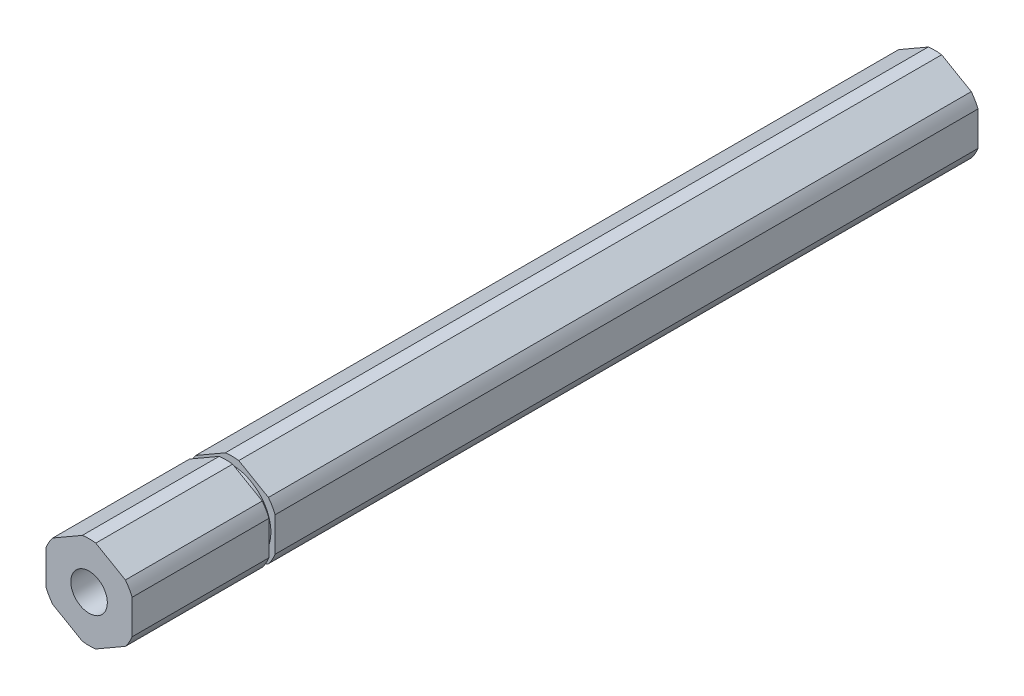
ISO-10303-21;
HEADER;
FILE_DESCRIPTION(('STEP AP214'),'2;1');
FILE_NAME('part.step','',(''),(''),'','','');
FILE_SCHEMA(('AUTOMOTIVE_DESIGN { 1 0 10303 214 1 1 1 1 }'));
ENDSEC;
DATA;
#1=APPLICATION_CONTEXT('core data for automotive mechanical design processes');
#2=APPLICATION_PROTOCOL_DEFINITION('international standard','automotive_design',2000,#1);
#3=PRODUCT_CONTEXT('',#1,'mechanical');
#4=PRODUCT('Part','Part','',(#3));
#5=PRODUCT_RELATED_PRODUCT_CATEGORY('part','',(#4));
#6=PRODUCT_DEFINITION_FORMATION('','',#4);
#7=PRODUCT_DEFINITION_CONTEXT('part definition',#1,'design');
#8=PRODUCT_DEFINITION('design','',#6,#7);
#9=PRODUCT_DEFINITION_SHAPE('','',#8);
#10=(LENGTH_UNIT() NAMED_UNIT(*) SI_UNIT(.MILLI.,.METRE.));
#11=(NAMED_UNIT(*) PLANE_ANGLE_UNIT() SI_UNIT($,.RADIAN.));
#12=(NAMED_UNIT(*) SI_UNIT($,.STERADIAN.) SOLID_ANGLE_UNIT());
#13=UNCERTAINTY_MEASURE_WITH_UNIT(LENGTH_MEASURE(1.E-05),#10,'distance_accuracy_value','');
#14=(GEOMETRIC_REPRESENTATION_CONTEXT(3) GLOBAL_UNCERTAINTY_ASSIGNED_CONTEXT((#13)) GLOBAL_UNIT_ASSIGNED_CONTEXT((#10,
#11,#12)) REPRESENTATION_CONTEXT('',''));
#15=CARTESIAN_POINT('',(0.,0.,0.));
#16=DIRECTION('',(0.,0.,1.));
#17=DIRECTION('',(1.,0.,0.));
#18=AXIS2_PLACEMENT_3D('',#15,#16,#17);
#19=CARTESIAN_POINT('',(4.7625,0.,46.76775));
#20=DIRECTION('',(-1.,0.,0.));
#21=DIRECTION('',(0.,-1.,0.));
#22=AXIS2_PLACEMENT_3D('',#19,#20,#21);
#23=PLANE('',#22);
#24=DIRECTION('',(0.,-1.,0.));
#25=VECTOR('',#24,1.);
#26=CARTESIAN_POINT('',(4.7625,0.,31.64205));
#27=LINE('',#26,#25);
#28=CARTESIAN_POINT('',(4.7625,1.89171391930704,31.64205));
#29=VERTEX_POINT('',#28);
#30=CARTESIAN_POINT('',(4.7625,-1.89171391930704,31.64205));
#31=VERTEX_POINT('',#30);
#32=EDGE_CURVE('E59',#29,#31,#27,.T.);
#33=ORIENTED_EDGE('',*,*,#32,.F.);
#34=DIRECTION('',(0.,0.,-1.));
#35=VECTOR('',#34,1.);
#36=CARTESIAN_POINT('',(4.7625,1.89171391930704,46.76775));
#37=LINE('',#36,#35);
#38=CARTESIAN_POINT('',(4.7625,1.89171391930704,46.76775));
#39=VERTEX_POINT('',#38);
#40=EDGE_CURVE('E201',#39,#29,#37,.T.);
#41=ORIENTED_EDGE('',*,*,#40,.F.);
#42=DIRECTION('',(0.,1.,0.));
#43=VECTOR('',#42,1.);
#44=CARTESIAN_POINT('',(4.7625,0.,46.76775));
#45=LINE('',#44,#43);
#46=CARTESIAN_POINT('',(4.7625,-1.89171391930704,46.76775));
#47=VERTEX_POINT('',#46);
#48=EDGE_CURVE('E372',#47,#39,#45,.T.);
#49=ORIENTED_EDGE('',*,*,#48,.F.);
#50=DIRECTION('',(0.,0.,-1.));
#51=VECTOR('',#50,1.);
#52=CARTESIAN_POINT('',(4.7625,-1.89171391930704,46.76775));
#53=LINE('',#52,#51);
#54=EDGE_CURVE('E215',#47,#31,#53,.T.);
#55=ORIENTED_EDGE('',*,*,#54,.T.);
#56=EDGE_LOOP('',(#33,#41,#49,#55));
#57=FACE_BOUND('',#56,.T.);
#58=ADVANCED_FACE('F37',(#57),#23,.F.);
#59=CARTESIAN_POINT('',(0.,0.,46.76775));
#60=DIRECTION('',(0.,0.,-1.));
#61=DIRECTION('',(-1.,0.,0.));
#62=AXIS2_PLACEMENT_3D('',#59,#60,#61);
#63=CYLINDRICAL_SURFACE('',#62,5.12445);
#64=CARTESIAN_POINT('',(0.,0.,31.64205));
#65=DIRECTION('',(0.,0.,-1.));
#66=DIRECTION('',(-1.,0.,0.));
#67=AXIS2_PLACEMENT_3D('',#64,#65,#66);
#68=CIRCLE('',#67,5.12445);
#69=CARTESIAN_POINT('',(4.01952231081252,3.17858902586987,31.64205));
#70=VERTEX_POINT('',#69);
#71=EDGE_CURVE('E361',#70,#29,#68,.T.);
#72=ORIENTED_EDGE('',*,*,#71,.F.);
#73=DIRECTION('',(0.,0.,-1.));
#74=VECTOR('',#73,1.);
#75=CARTESIAN_POINT('',(4.01952231081252,3.17858902586987,46.76775));
#76=LINE('',#75,#74);
#77=CARTESIAN_POINT('',(4.01952231081252,3.17858902586987,46.76775));
#78=VERTEX_POINT('',#77);
#79=EDGE_CURVE('E264',#78,#70,#76,.T.);
#80=ORIENTED_EDGE('',*,*,#79,.F.);
#81=CARTESIAN_POINT('',(0.,0.,46.76775));
#82=DIRECTION('',(0.,0.,1.));
#83=DIRECTION('',(1.,0.,0.));
#84=AXIS2_PLACEMENT_3D('',#81,#82,#83);
#85=CIRCLE('',#84,5.12445);
#86=EDGE_CURVE('E223',#39,#78,#85,.T.);
#87=ORIENTED_EDGE('',*,*,#86,.F.);
#88=ORIENTED_EDGE('',*,*,#40,.T.);
#89=EDGE_LOOP('',(#72,#80,#87,#88));
#90=FACE_BOUND('',#89,.T.);
#91=ADVANCED_FACE('F435',(#90),#63,.T.);
#92=CARTESIAN_POINT('',(2.38125,4.12444598552339,46.76775));
#93=DIRECTION('',(-0.5,-0.866025403784439,0.));
#94=DIRECTION('',(0.866025403784439,-0.5,0.));
#95=AXIS2_PLACEMENT_3D('',#92,#93,#94);
#96=PLANE('',#95);
#97=DIRECTION('',(0.866025403784439,-0.5,0.));
#98=VECTOR('',#97,1.);
#99=CARTESIAN_POINT('',(2.38125,4.12444598552339,31.64205));
#100=LINE('',#99,#98);
#101=CARTESIAN_POINT('',(0.742977689187476,5.07030294517691,31.64205));
#102=VERTEX_POINT('',#101);
#103=EDGE_CURVE('E359',#102,#70,#100,.T.);
#104=ORIENTED_EDGE('',*,*,#103,.F.);
#105=DIRECTION('',(0.,0.,-1.));
#106=VECTOR('',#105,1.);
#107=CARTESIAN_POINT('',(0.742977689187476,5.07030294517691,46.76775));
#108=LINE('',#107,#106);
#109=CARTESIAN_POINT('',(0.742977689187476,5.07030294517691,46.76775));
#110=VERTEX_POINT('',#109);
#111=EDGE_CURVE('E260',#110,#102,#108,.T.);
#112=ORIENTED_EDGE('',*,*,#111,.F.);
#113=DIRECTION('',(-0.866025403784439,0.5,0.));
#114=VECTOR('',#113,1.);
#115=CARTESIAN_POINT('',(2.38125,4.12444598552339,46.76775));
#116=LINE('',#115,#114);
#117=EDGE_CURVE('E375',#78,#110,#116,.T.);
#118=ORIENTED_EDGE('',*,*,#117,.F.);
#119=ORIENTED_EDGE('',*,*,#79,.T.);
#120=EDGE_LOOP('',(#104,#112,#118,#119));
#121=FACE_BOUND('',#120,.T.);
#122=ADVANCED_FACE('F438',(#121),#96,.F.);
#123=CARTESIAN_POINT('',(0.,0.,31.64205));
#124=DIRECTION('',(0.,0.,-1.));
#125=DIRECTION('',(-1.,0.,0.));
#126=AXIS2_PLACEMENT_3D('',#123,#124,#125);
#127=CIRCLE('',#126,5.12445);
#128=CARTESIAN_POINT('',(-0.742977689187478,5.07030294517691,31.64205));
#129=VERTEX_POINT('',#128);
#130=EDGE_CURVE('E357',#129,#102,#127,.T.);
#131=ORIENTED_EDGE('',*,*,#130,.F.);
#132=DIRECTION('',(0.,0.,-1.));
#133=VECTOR('',#132,1.);
#134=CARTESIAN_POINT('',(-0.742977689187479,5.07030294517691,46.76775));
#135=LINE('',#134,#133);
#136=CARTESIAN_POINT('',(-0.742977689187479,5.07030294517691,46.76775));
#137=VERTEX_POINT('',#136);
#138=EDGE_CURVE('E256',#137,#129,#135,.T.);
#139=ORIENTED_EDGE('',*,*,#138,.F.);
#140=EDGE_CURVE('E376',#110,#137,#85,.T.);
#141=ORIENTED_EDGE('',*,*,#140,.F.);
#142=ORIENTED_EDGE('',*,*,#111,.T.);
#143=EDGE_LOOP('',(#131,#139,#141,#142));
#144=FACE_BOUND('',#143,.T.);
#145=ADVANCED_FACE('F400',(#144),#63,.T.);
#146=CARTESIAN_POINT('',(-2.38125,4.12444598552339,46.76775));
#147=DIRECTION('',(0.5,-0.866025403784438,0.));
#148=DIRECTION('',(0.866025403784438,0.5,0.));
#149=AXIS2_PLACEMENT_3D('',#146,#147,#148);
#150=PLANE('',#149);
#151=DIRECTION('',(0.866025403784438,0.5,0.));
#152=VECTOR('',#151,1.);
#153=CARTESIAN_POINT('',(-2.38125,4.12444598552339,31.64205));
#154=LINE('',#153,#152);
#155=CARTESIAN_POINT('',(-4.01952231081252,3.17858902586987,31.64205));
#156=VERTEX_POINT('',#155);
#157=EDGE_CURVE('E355',#156,#129,#154,.T.);
#158=ORIENTED_EDGE('',*,*,#157,.F.);
#159=DIRECTION('',(0.,0.,-1.));
#160=VECTOR('',#159,1.);
#161=CARTESIAN_POINT('',(-4.01952231081252,3.17858902586987,46.76775));
#162=LINE('',#161,#160);
#163=CARTESIAN_POINT('',(-4.01952231081252,3.17858902586987,46.76775));
#164=VERTEX_POINT('',#163);
#165=EDGE_CURVE('E252',#164,#156,#162,.T.);
#166=ORIENTED_EDGE('',*,*,#165,.F.);
#167=DIRECTION('',(-0.866025403784438,-0.5,0.));
#168=VECTOR('',#167,1.);
#169=CARTESIAN_POINT('',(-2.38125,4.12444598552339,46.76775));
#170=LINE('',#169,#168);
#171=EDGE_CURVE('E378',#137,#164,#170,.T.);
#172=ORIENTED_EDGE('',*,*,#171,.F.);
#173=ORIENTED_EDGE('',*,*,#138,.T.);
#174=EDGE_LOOP('',(#158,#166,#172,#173));
#175=FACE_BOUND('',#174,.T.);
#176=ADVANCED_FACE('F403',(#175),#150,.F.);
#177=CARTESIAN_POINT('',(0.,0.,31.64205));
#178=DIRECTION('',(0.,0.,-1.));
#179=DIRECTION('',(-1.,0.,0.));
#180=AXIS2_PLACEMENT_3D('',#177,#178,#179);
#181=CIRCLE('',#180,5.12445);
#182=CARTESIAN_POINT('',(-4.7625,1.89171391930703,31.64205));
#183=VERTEX_POINT('',#182);
#184=EDGE_CURVE('E353',#183,#156,#181,.T.);
#185=ORIENTED_EDGE('',*,*,#184,.F.);
#186=DIRECTION('',(0.,0.,-1.));
#187=VECTOR('',#186,1.);
#188=CARTESIAN_POINT('',(-4.7625,1.89171391930703,46.76775));
#189=LINE('',#188,#187);
#190=CARTESIAN_POINT('',(-4.7625,1.89171391930703,46.76775));
#191=VERTEX_POINT('',#190);
#192=EDGE_CURVE('E248',#191,#183,#189,.T.);
#193=ORIENTED_EDGE('',*,*,#192,.F.);
#194=EDGE_CURVE('E380',#164,#191,#85,.T.);
#195=ORIENTED_EDGE('',*,*,#194,.F.);
#196=ORIENTED_EDGE('',*,*,#165,.T.);
#197=EDGE_LOOP('',(#185,#193,#195,#196));
#198=FACE_BOUND('',#197,.T.);
#199=ADVANCED_FACE('F406',(#198),#63,.T.);
#200=CARTESIAN_POINT('',(-4.7625,0.,46.76775));
#201=DIRECTION('',(1.,0.,0.));
#202=DIRECTION('',(0.,1.,0.));
#203=AXIS2_PLACEMENT_3D('',#200,#201,#202);
#204=PLANE('',#203);
#205=DIRECTION('',(0.,1.,0.));
#206=VECTOR('',#205,1.);
#207=CARTESIAN_POINT('',(-4.7625,0.,31.64205));
#208=LINE('',#207,#206);
#209=CARTESIAN_POINT('',(-4.7625,-1.89171391930704,31.64205));
#210=VERTEX_POINT('',#209);
#211=EDGE_CURVE('E351',#210,#183,#208,.T.);
#212=ORIENTED_EDGE('',*,*,#211,.F.);
#213=DIRECTION('',(0.,0.,-1.));
#214=VECTOR('',#213,1.);
#215=CARTESIAN_POINT('',(-4.7625,-1.89171391930704,46.76775));
#216=LINE('',#215,#214);
#217=CARTESIAN_POINT('',(-4.7625,-1.89171391930704,46.76775));
#218=VERTEX_POINT('',#217);
#219=EDGE_CURVE('E244',#218,#210,#216,.T.);
#220=ORIENTED_EDGE('',*,*,#219,.F.);
#221=DIRECTION('',(0.,-1.,0.));
#222=VECTOR('',#221,1.);
#223=CARTESIAN_POINT('',(-4.7625,0.,46.76775));
#224=LINE('',#223,#222);
#225=EDGE_CURVE('E381',#191,#218,#224,.T.);
#226=ORIENTED_EDGE('',*,*,#225,.F.);
#227=ORIENTED_EDGE('',*,*,#192,.T.);
#228=EDGE_LOOP('',(#212,#220,#226,#227));
#229=FACE_BOUND('',#228,.T.);
#230=ADVANCED_FACE('F411',(#229),#204,.F.);
#231=CARTESIAN_POINT('',(0.,0.,31.64205));
#232=DIRECTION('',(0.,0.,-1.));
#233=DIRECTION('',(-1.,0.,0.));
#234=AXIS2_PLACEMENT_3D('',#231,#232,#233);
#235=CIRCLE('',#234,5.12445);
#236=CARTESIAN_POINT('',(-4.01952231081252,-3.17858902586988,31.64205));
#237=VERTEX_POINT('',#236);
#238=EDGE_CURVE('E349',#237,#210,#235,.T.);
#239=ORIENTED_EDGE('',*,*,#238,.F.);
#240=DIRECTION('',(0.,0.,-1.));
#241=VECTOR('',#240,1.);
#242=CARTESIAN_POINT('',(-4.01952231081252,-3.17858902586988,46.76775));
#243=LINE('',#242,#241);
#244=CARTESIAN_POINT('',(-4.01952231081252,-3.17858902586988,46.76775));
#245=VERTEX_POINT('',#244);
#246=EDGE_CURVE('E240',#245,#237,#243,.T.);
#247=ORIENTED_EDGE('',*,*,#246,.F.);
#248=EDGE_CURVE('E382',#218,#245,#85,.T.);
#249=ORIENTED_EDGE('',*,*,#248,.F.);
#250=ORIENTED_EDGE('',*,*,#219,.T.);
#251=EDGE_LOOP('',(#239,#247,#249,#250));
#252=FACE_BOUND('',#251,.T.);
#253=ADVANCED_FACE('F414',(#252),#63,.T.);
#254=CARTESIAN_POINT('',(-2.38125,-4.12444598552339,46.76775));
#255=DIRECTION('',(0.5,0.866025403784439,0.));
#256=DIRECTION('',(-0.866025403784439,0.5,0.));
#257=AXIS2_PLACEMENT_3D('',#254,#255,#256);
#258=PLANE('',#257);
#259=DIRECTION('',(-0.866025403784439,0.5,0.));
#260=VECTOR('',#259,1.);
#261=CARTESIAN_POINT('',(-2.38125,-4.12444598552339,31.64205));
#262=LINE('',#261,#260);
#263=CARTESIAN_POINT('',(-0.742977689187483,-5.07030294517691,31.64205));
#264=VERTEX_POINT('',#263);
#265=EDGE_CURVE('E347',#264,#237,#262,.T.);
#266=ORIENTED_EDGE('',*,*,#265,.F.);
#267=DIRECTION('',(0.,0.,-1.));
#268=VECTOR('',#267,1.);
#269=CARTESIAN_POINT('',(-0.742977689187483,-5.07030294517691,46.76775));
#270=LINE('',#269,#268);
#271=CARTESIAN_POINT('',(-0.742977689187483,-5.07030294517691,46.76775));
#272=VERTEX_POINT('',#271);
#273=EDGE_CURVE('E236',#272,#264,#270,.T.);
#274=ORIENTED_EDGE('',*,*,#273,.F.);
#275=DIRECTION('',(0.866025403784439,-0.5,0.));
#276=VECTOR('',#275,1.);
#277=CARTESIAN_POINT('',(-2.38125,-4.12444598552339,46.76775));
#278=LINE('',#277,#276);
#279=EDGE_CURVE('E383',#245,#272,#278,.T.);
#280=ORIENTED_EDGE('',*,*,#279,.F.);
#281=ORIENTED_EDGE('',*,*,#246,.T.);
#282=EDGE_LOOP('',(#266,#274,#280,#281));
#283=FACE_BOUND('',#282,.T.);
#284=ADVANCED_FACE('F417',(#283),#258,.F.);
#285=CARTESIAN_POINT('',(0.,0.,31.64205));
#286=DIRECTION('',(0.,0.,-1.));
#287=DIRECTION('',(-1.,0.,0.));
#288=AXIS2_PLACEMENT_3D('',#285,#286,#287);
#289=CIRCLE('',#288,5.12445);
#290=CARTESIAN_POINT('',(0.742977689187481,-5.07030294517691,31.64205));
#291=VERTEX_POINT('',#290);
#292=EDGE_CURVE('E345',#291,#264,#289,.T.);
#293=ORIENTED_EDGE('',*,*,#292,.F.);
#294=DIRECTION('',(0.,0.,-1.));
#295=VECTOR('',#294,1.);
#296=CARTESIAN_POINT('',(0.742977689187482,-5.07030294517691,46.76775));
#297=LINE('',#296,#295);
#298=CARTESIAN_POINT('',(0.742977689187482,-5.07030294517691,46.76775));
#299=VERTEX_POINT('',#298);
#300=EDGE_CURVE('E232',#299,#291,#297,.T.);
#301=ORIENTED_EDGE('',*,*,#300,.F.);
#302=EDGE_CURVE('E222',#272,#299,#85,.T.);
#303=ORIENTED_EDGE('',*,*,#302,.F.);
#304=ORIENTED_EDGE('',*,*,#273,.T.);
#305=EDGE_LOOP('',(#293,#301,#303,#304));
#306=FACE_BOUND('',#305,.T.);
#307=ADVANCED_FACE('F422',(#306),#63,.T.);
#308=CARTESIAN_POINT('',(2.38125,-4.12444598552339,46.76775));
#309=DIRECTION('',(-0.500000000000001,0.866025403784438,0.));
#310=DIRECTION('',(-0.866025403784438,-0.500000000000001,0.));
#311=AXIS2_PLACEMENT_3D('',#308,#309,#310);
#312=PLANE('',#311);
#313=DIRECTION('',(-0.866025403784438,-0.500000000000001,0.));
#314=VECTOR('',#313,1.);
#315=CARTESIAN_POINT('',(2.38125,-4.12444598552339,31.64205));
#316=LINE('',#315,#314);
#317=CARTESIAN_POINT('',(4.01952231081252,-3.17858902586987,31.64205));
#318=VERTEX_POINT('',#317);
#319=EDGE_CURVE('E208',#318,#291,#316,.T.);
#320=ORIENTED_EDGE('',*,*,#319,.F.);
#321=DIRECTION('',(0.,0.,-1.));
#322=VECTOR('',#321,1.);
#323=CARTESIAN_POINT('',(4.01952231081252,-3.17858902586987,46.76775));
#324=LINE('',#323,#322);
#325=CARTESIAN_POINT('',(4.01952231081252,-3.17858902586987,46.76775));
#326=VERTEX_POINT('',#325);
#327=EDGE_CURVE('E228',#326,#318,#324,.T.);
#328=ORIENTED_EDGE('',*,*,#327,.F.);
#329=DIRECTION('',(0.866025403784438,0.500000000000001,0.));
#330=VECTOR('',#329,1.);
#331=CARTESIAN_POINT('',(2.38125,-4.12444598552339,46.76775));
#332=LINE('',#331,#330);
#333=EDGE_CURVE('E220',#299,#326,#332,.T.);
#334=ORIENTED_EDGE('',*,*,#333,.F.);
#335=ORIENTED_EDGE('',*,*,#300,.T.);
#336=EDGE_LOOP('',(#320,#328,#334,#335));
#337=FACE_BOUND('',#336,.T.);
#338=ADVANCED_FACE('F429',(#337),#312,.F.);
#339=CARTESIAN_POINT('',(0.,0.,31.64205));
#340=DIRECTION('',(0.,0.,-1.));
#341=DIRECTION('',(-1.,0.,0.));
#342=AXIS2_PLACEMENT_3D('',#339,#340,#341);
#343=CIRCLE('',#342,5.12445);
#344=EDGE_CURVE('E11',#31,#318,#343,.T.);
#345=ORIENTED_EDGE('',*,*,#344,.F.);
#346=ORIENTED_EDGE('',*,*,#54,.F.);
#347=EDGE_CURVE('E216',#326,#47,#85,.T.);
#348=ORIENTED_EDGE('',*,*,#347,.F.);
#349=ORIENTED_EDGE('',*,*,#327,.T.);
#350=EDGE_LOOP('',(#345,#346,#348,#349));
#351=FACE_BOUND('',#350,.T.);
#352=ADVANCED_FACE('F431',(#351),#63,.T.);
#353=CARTESIAN_POINT('',(0.,0.,46.76775));
#354=DIRECTION('',(0.,0.,1.));
#355=DIRECTION('',(1.,0.,0.));
#356=AXIS2_PLACEMENT_3D('',#353,#354,#355);
#357=PLANE('',#356);
#358=CARTESIAN_POINT('',(0.,0.,46.76775));
#359=DIRECTION('',(0.,0.,-1.));
#360=DIRECTION('',(-1.,0.,0.));
#361=AXIS2_PLACEMENT_3D('',#358,#359,#360);
#362=CIRCLE('',#361,2.0193);
#363=CARTESIAN_POINT('',(2.0193,0.,46.76775));
#364=VERTEX_POINT('',#363);
#365=EDGE_CURVE('E364',#364,#364,#362,.T.);
#366=ORIENTED_EDGE('',*,*,#365,.T.);
#367=EDGE_LOOP('',(#366));
#368=FACE_BOUND('',#367,.T.);
#369=ORIENTED_EDGE('',*,*,#48,.T.);
#370=ORIENTED_EDGE('',*,*,#86,.T.);
#371=ORIENTED_EDGE('',*,*,#117,.T.);
#372=ORIENTED_EDGE('',*,*,#140,.T.);
#373=ORIENTED_EDGE('',*,*,#171,.T.);
#374=ORIENTED_EDGE('',*,*,#194,.T.);
#375=ORIENTED_EDGE('',*,*,#225,.T.);
#376=ORIENTED_EDGE('',*,*,#248,.T.);
#377=ORIENTED_EDGE('',*,*,#279,.T.);
#378=ORIENTED_EDGE('',*,*,#302,.T.);
#379=ORIENTED_EDGE('',*,*,#333,.T.);
#380=ORIENTED_EDGE('',*,*,#347,.T.);
#381=EDGE_LOOP('',(#369,#370,#371,#372,#373,#374,#375,#376,#377,#378,#379,#380));
#382=FACE_BOUND('',#381,.T.);
#383=ADVANCED_FACE('F393',(#368,#382),#357,.T.);
#384=CARTESIAN_POINT('',(0.,0.,27.71775));
#385=DIRECTION('',(0.,0.,1.));
#386=DIRECTION('',(1.,0.,0.));
#387=AXIS2_PLACEMENT_3D('',#384,#385,#386);
#388=CYLINDRICAL_SURFACE('',#387,2.0193);
#389=CARTESIAN_POINT('',(0.,0.,27.71775));
#390=DIRECTION('',(0.,0.,-1.));
#391=DIRECTION('',(-1.,0.,0.));
#392=AXIS2_PLACEMENT_3D('',#389,#390,#391);
#393=CIRCLE('',#392,2.0193);
#394=CARTESIAN_POINT('',(2.0193,0.,27.71775));
#395=VERTEX_POINT('',#394);
#396=EDGE_CURVE('E365',#395,#395,#393,.T.);
#397=CARTESIAN_POINT('',(2.0193,0.,27.71775));
#398=CARTESIAN_POINT('',(2.0193,0.,27.9161875));
#399=CARTESIAN_POINT('',(2.0193,0.,28.114625));
#400=CARTESIAN_POINT('',(2.0193,0.,28.5115));
#401=CARTESIAN_POINT('',(2.0193,0.,28.7099375));
#402=CARTESIAN_POINT('',(2.0193,0.,29.1068125));
#403=CARTESIAN_POINT('',(2.0193,0.,29.30525));
#404=CARTESIAN_POINT('',(2.0193,0.,29.702125));
#405=CARTESIAN_POINT('',(2.0193,0.,29.9005625));
#406=CARTESIAN_POINT('',(2.0193,0.,30.2974375));
#407=CARTESIAN_POINT('',(2.0193,0.,30.495875));
#408=CARTESIAN_POINT('',(2.0193,0.,30.89275));
#409=CARTESIAN_POINT('',(2.0193,0.,31.0911875));
#410=CARTESIAN_POINT('',(2.0193,0.,31.4880625));
#411=CARTESIAN_POINT('',(2.0193,0.,31.6865));
#412=CARTESIAN_POINT('',(2.0193,0.,32.083375));
#413=CARTESIAN_POINT('',(2.0193,0.,32.2818125));
#414=CARTESIAN_POINT('',(2.0193,0.,32.6786875));
#415=CARTESIAN_POINT('',(2.0193,0.,32.877125));
#416=CARTESIAN_POINT('',(2.0193,0.,33.274));
#417=CARTESIAN_POINT('',(2.0193,0.,33.4724375));
#418=CARTESIAN_POINT('',(2.0193,0.,33.8693125));
#419=CARTESIAN_POINT('',(2.0193,0.,34.06775));
#420=CARTESIAN_POINT('',(2.0193,0.,34.464625));
#421=CARTESIAN_POINT('',(2.0193,0.,34.6630625));
#422=CARTESIAN_POINT('',(2.0193,0.,35.0599375));
#423=CARTESIAN_POINT('',(2.0193,0.,35.258375));
#424=CARTESIAN_POINT('',(2.0193,0.,35.65525));
#425=CARTESIAN_POINT('',(2.0193,0.,35.8536875));
#426=CARTESIAN_POINT('',(2.0193,0.,36.2505625));
#427=CARTESIAN_POINT('',(2.0193,0.,36.449));
#428=CARTESIAN_POINT('',(2.0193,0.,36.845875));
#429=CARTESIAN_POINT('',(2.0193,0.,37.0443125));
#430=CARTESIAN_POINT('',(2.0193,0.,37.4411875));
#431=CARTESIAN_POINT('',(2.0193,0.,37.639625));
#432=CARTESIAN_POINT('',(2.0193,0.,38.0365));
#433=CARTESIAN_POINT('',(2.0193,0.,38.2349375));
#434=CARTESIAN_POINT('',(2.0193,0.,38.6318125));
#435=CARTESIAN_POINT('',(2.0193,0.,38.83025));
#436=CARTESIAN_POINT('',(2.0193,0.,39.227125));
#437=CARTESIAN_POINT('',(2.0193,0.,39.4255625));
#438=CARTESIAN_POINT('',(2.0193,0.,39.8224375));
#439=CARTESIAN_POINT('',(2.0193,0.,40.020875));
#440=CARTESIAN_POINT('',(2.0193,0.,40.41775));
#441=CARTESIAN_POINT('',(2.0193,0.,40.6161875));
#442=CARTESIAN_POINT('',(2.0193,0.,41.0130625));
#443=CARTESIAN_POINT('',(2.0193,0.,41.2115));
#444=CARTESIAN_POINT('',(2.0193,0.,41.608375));
#445=CARTESIAN_POINT('',(2.0193,0.,41.8068125));
#446=CARTESIAN_POINT('',(2.0193,0.,42.2036875));
#447=CARTESIAN_POINT('',(2.0193,0.,42.402125));
#448=CARTESIAN_POINT('',(2.0193,0.,42.799));
#449=CARTESIAN_POINT('',(2.0193,0.,42.9974375));
#450=CARTESIAN_POINT('',(2.0193,0.,43.3943125));
#451=CARTESIAN_POINT('',(2.0193,0.,43.59275));
#452=CARTESIAN_POINT('',(2.0193,0.,43.989625));
#453=CARTESIAN_POINT('',(2.0193,0.,44.1880625));
#454=CARTESIAN_POINT('',(2.0193,0.,44.5849375));
#455=CARTESIAN_POINT('',(2.0193,0.,44.783375));
#456=CARTESIAN_POINT('',(2.0193,0.,45.18025));
#457=CARTESIAN_POINT('',(2.0193,0.,45.3786875));
#458=CARTESIAN_POINT('',(2.0193,0.,45.7755625));
#459=CARTESIAN_POINT('',(2.0193,0.,45.974));
#460=CARTESIAN_POINT('',(2.0193,0.,46.370875));
#461=CARTESIAN_POINT('',(2.0193,0.,46.5693125));
#462=CARTESIAN_POINT('',(2.0193,0.,46.76775));
#463=B_SPLINE_CURVE_WITH_KNOTS('',3,(#397,#398,#399,#400,#401,#402,#403,#404,#405,#406,#407,
#408,#409,#410,#411,#412,#413,#414,#415,#416,#417,#418,#419,#420,#421,#422,#423,#424,#425,#426,
#427,#428,#429,#430,#431,#432,#433,#434,#435,#436,#437,#438,#439,#440,#441,#442,#443,#444,#445,
#446,#447,#448,#449,#450,#451,#452,#453,#454,#455,#456,#457,#458,#459,#460,#461,#462),
.UNSPECIFIED.,.F.,.F.,(4,2,2,2,2,2,2,2,2,2,2,2,2,2,2,2,2,2,2,2,2,2,2,2,2,2,2,2,2,2,2,2,4),(0.,
0.5953125,1.190625,1.7859375,2.38125,2.9765625,3.57187500000001,4.16718750000001,
4.76250000000001,5.35781250000001,5.95312500000001,6.54843750000001,7.14375000000001,
7.73906250000001,8.33437500000001,8.92968750000001,9.52500000000001,10.1203125,10.715625,
11.3109375,11.90625,12.5015625,13.096875,13.6921875,14.2875,14.8828125,15.478125,16.0734375,
16.66875,17.2640625,17.859375,18.4546875,19.05),.UNSPECIFIED.);
#464=EDGE_CURVE('BSEAM451',#395,#364,#463,.T.);
#465=ORIENTED_EDGE('',*,*,#396,.T.);
#466=ORIENTED_EDGE('',*,*,#365,.F.);
#467=ORIENTED_EDGE('',*,*,#464,.T.);
#468=ORIENTED_EDGE('',*,*,#464,.F.);
#469=EDGE_LOOP('',(#465,#467,#466,#468));
#470=FACE_BOUND('',#469,.T.);
#471=ADVANCED_FACE('F451',(#470),#388,.F.);
#472=CARTESIAN_POINT('',(0.,0.,27.71775));
#473=DIRECTION('',(0.,0.,1.));
#474=DIRECTION('',(-1.,0.,0.));
#475=AXIS2_PLACEMENT_3D('',#472,#473,#474);
#476=PLANE('',#475);
#477=ORIENTED_EDGE('',*,*,#396,.F.);
#478=EDGE_LOOP('',(#477));
#479=FACE_BOUND('',#478,.T.);
#480=ADVANCED_FACE('F441',(#479),#476,.T.);
#481=CARTESIAN_POINT('',(0.,0.,31.64205));
#482=DIRECTION('',(0.,0.,-1.));
#483=DIRECTION('',(-1.,0.,0.));
#484=AXIS2_PLACEMENT_3D('',#481,#482,#483);
#485=PLANE('',#484);
#486=CARTESIAN_POINT('',(0.,0.,31.64205));
#487=DIRECTION('',(0.,0.,-1.));
#488=DIRECTION('',(-1.,0.,0.));
#489=AXIS2_PLACEMENT_3D('',#486,#487,#488);
#490=CIRCLE('',#489,4.2926);
#491=CARTESIAN_POINT('',(-4.2926,0.,31.64205));
#492=VERTEX_POINT('',#491);
#493=EDGE_CURVE('E534',#492,#492,#490,.T.);
#494=ORIENTED_EDGE('',*,*,#493,.F.);
#495=EDGE_LOOP('',(#494));
#496=FACE_BOUND('',#495,.T.);
#497=ORIENTED_EDGE('',*,*,#32,.T.);
#498=ORIENTED_EDGE('',*,*,#344,.T.);
#499=ORIENTED_EDGE('',*,*,#319,.T.);
#500=ORIENTED_EDGE('',*,*,#292,.T.);
#501=ORIENTED_EDGE('',*,*,#265,.T.);
#502=ORIENTED_EDGE('',*,*,#238,.T.);
#503=ORIENTED_EDGE('',*,*,#211,.T.);
#504=ORIENTED_EDGE('',*,*,#184,.T.);
#505=ORIENTED_EDGE('',*,*,#157,.T.);
#506=ORIENTED_EDGE('',*,*,#130,.T.);
#507=ORIENTED_EDGE('',*,*,#103,.T.);
#508=ORIENTED_EDGE('',*,*,#71,.T.);
#509=EDGE_LOOP('',(#497,#498,#499,#500,#501,#502,#503,#504,#505,#506,#507,#508));
#510=FACE_BOUND('',#509,.T.);
#511=ADVANCED_FACE('F439',(#496,#510),#485,.T.);
#512=CARTESIAN_POINT('',(0.,0.,30.95625));
#513=DIRECTION('',(0.,0.,-1.));
#514=DIRECTION('',(-1.,0.,0.));
#515=AXIS2_PLACEMENT_3D('',#512,#513,#514);
#516=PLANE('',#515);
#517=CARTESIAN_POINT('',(0.,0.,30.95625));
#518=DIRECTION('',(0.,0.,-1.));
#519=DIRECTION('',(-1.,0.,0.));
#520=AXIS2_PLACEMENT_3D('',#517,#518,#519);
#521=CIRCLE('',#520,4.2926);
#522=CARTESIAN_POINT('',(-4.2926,0.,30.95625));
#523=VERTEX_POINT('',#522);
#524=EDGE_CURVE('E535',#523,#523,#521,.T.);
#525=ORIENTED_EDGE('',*,*,#524,.T.);
#526=EDGE_LOOP('',(#525));
#527=FACE_BOUND('',#526,.T.);
#528=CARTESIAN_POINT('',(0.,0.,30.95625));
#529=DIRECTION('',(0.,0.,-1.));
#530=DIRECTION('',(-1.,0.,0.));
#531=AXIS2_PLACEMENT_3D('',#528,#529,#530);
#532=CIRCLE('',#531,5.12445);
#533=CARTESIAN_POINT('',(4.01952231081252,3.17858902586987,30.95625));
#534=VERTEX_POINT('',#533);
#535=CARTESIAN_POINT('',(4.7625,1.89171391930704,30.95625));
#536=VERTEX_POINT('',#535);
#537=EDGE_CURVE('E209',#534,#536,#532,.T.);
#538=ORIENTED_EDGE('',*,*,#537,.F.);
#539=DIRECTION('',(0.866025403784439,-0.5,0.));
#540=VECTOR('',#539,1.);
#541=CARTESIAN_POINT('',(2.38125,4.12444598552339,30.95625));
#542=LINE('',#541,#540);
#543=CARTESIAN_POINT('',(0.742977689187476,5.07030294517691,30.95625));
#544=VERTEX_POINT('',#543);
#545=EDGE_CURVE('E335',#544,#534,#542,.T.);
#546=ORIENTED_EDGE('',*,*,#545,.F.);
#547=CARTESIAN_POINT('',(0.,0.,30.95625));
#548=DIRECTION('',(0.,0.,-1.));
#549=DIRECTION('',(-1.,0.,0.));
#550=AXIS2_PLACEMENT_3D('',#547,#548,#549);
#551=CIRCLE('',#550,5.12445);
#552=CARTESIAN_POINT('',(-0.742977689187478,5.07030294517691,30.95625));
#553=VERTEX_POINT('',#552);
#554=EDGE_CURVE('E332',#553,#544,#551,.T.);
#555=ORIENTED_EDGE('',*,*,#554,.F.);
#556=DIRECTION('',(0.866025403784438,0.5,0.));
#557=VECTOR('',#556,1.);
#558=CARTESIAN_POINT('',(-2.38125,4.12444598552339,30.95625));
#559=LINE('',#558,#557);
#560=CARTESIAN_POINT('',(-4.01952231081252,3.17858902586987,30.95625));
#561=VERTEX_POINT('',#560);
#562=EDGE_CURVE('E330',#561,#553,#559,.T.);
#563=ORIENTED_EDGE('',*,*,#562,.F.);
#564=CARTESIAN_POINT('',(0.,0.,30.95625));
#565=DIRECTION('',(0.,0.,-1.));
#566=DIRECTION('',(-1.,0.,0.));
#567=AXIS2_PLACEMENT_3D('',#564,#565,#566);
#568=CIRCLE('',#567,5.12445);
#569=CARTESIAN_POINT('',(-4.7625,1.89171391930703,30.95625));
#570=VERTEX_POINT('',#569);
#571=EDGE_CURVE('E333',#570,#561,#568,.T.);
#572=ORIENTED_EDGE('',*,*,#571,.F.);
#573=DIRECTION('',(0.,1.,0.));
#574=VECTOR('',#573,1.);
#575=CARTESIAN_POINT('',(-4.7625,0.,30.95625));
#576=LINE('',#575,#574);
#577=CARTESIAN_POINT('',(-4.7625,-1.89171391930704,30.95625));
#578=VERTEX_POINT('',#577);
#579=EDGE_CURVE('E337',#578,#570,#576,.T.);
#580=ORIENTED_EDGE('',*,*,#579,.F.);
#581=CARTESIAN_POINT('',(0.,0.,30.95625));
#582=DIRECTION('',(0.,0.,-1.));
#583=DIRECTION('',(-1.,0.,0.));
#584=AXIS2_PLACEMENT_3D('',#581,#582,#583);
#585=CIRCLE('',#584,5.12445);
#586=CARTESIAN_POINT('',(-4.01952231081252,-3.17858902586988,30.95625));
#587=VERTEX_POINT('',#586);
#588=EDGE_CURVE('E525',#587,#578,#585,.T.);
#589=ORIENTED_EDGE('',*,*,#588,.F.);
#590=DIRECTION('',(-0.866025403784439,0.5,0.));
#591=VECTOR('',#590,1.);
#592=CARTESIAN_POINT('',(-2.38125,-4.12444598552339,30.95625));
#593=LINE('',#592,#591);
#594=CARTESIAN_POINT('',(-0.742977689187483,-5.07030294517691,30.95625));
#595=VERTEX_POINT('',#594);
#596=EDGE_CURVE('E524',#595,#587,#593,.T.);
#597=ORIENTED_EDGE('',*,*,#596,.F.);
#598=CARTESIAN_POINT('',(0.,0.,30.95625));
#599=DIRECTION('',(0.,0.,-1.));
#600=DIRECTION('',(-1.,0.,0.));
#601=AXIS2_PLACEMENT_3D('',#598,#599,#600);
#602=CIRCLE('',#601,5.12445);
#603=CARTESIAN_POINT('',(0.742977689187481,-5.07030294517691,30.95625));
#604=VERTEX_POINT('',#603);
#605=EDGE_CURVE('E522',#604,#595,#602,.T.);
#606=ORIENTED_EDGE('',*,*,#605,.F.);
#607=DIRECTION('',(-0.866025403784438,-0.500000000000001,0.));
#608=VECTOR('',#607,1.);
#609=CARTESIAN_POINT('',(2.38125,-4.12444598552339,30.95625));
#610=LINE('',#609,#608);
#611=CARTESIAN_POINT('',(4.01952231081252,-3.17858902586987,30.95625));
#612=VERTEX_POINT('',#611);
#613=EDGE_CURVE('E52',#612,#604,#610,.T.);
#614=ORIENTED_EDGE('',*,*,#613,.F.);
#615=CARTESIAN_POINT('',(0.,0.,30.95625));
#616=DIRECTION('',(0.,0.,-1.));
#617=DIRECTION('',(-1.,0.,0.));
#618=AXIS2_PLACEMENT_3D('',#615,#616,#617);
#619=CIRCLE('',#618,5.12445);
#620=CARTESIAN_POINT('',(4.7625,-1.89171391930704,30.95625));
#621=VERTEX_POINT('',#620);
#622=EDGE_CURVE('E45',#621,#612,#619,.T.);
#623=ORIENTED_EDGE('',*,*,#622,.F.);
#624=DIRECTION('',(0.,-1.,0.));
#625=VECTOR('',#624,1.);
#626=CARTESIAN_POINT('',(4.7625,0.,30.95625));
#627=LINE('',#626,#625);
#628=EDGE_CURVE('E196',#536,#621,#627,.T.);
#629=ORIENTED_EDGE('',*,*,#628,.F.);
#630=EDGE_LOOP('',(#538,#546,#555,#563,#572,#580,#589,#597,#606,#614,#623,#629));
#631=FACE_BOUND('',#630,.T.);
#632=ADVANCED_FACE('F195',(#527,#631),#516,.F.);
#633=CARTESIAN_POINT('',(0.,0.,31.64205));
#634=DIRECTION('',(0.,0.,-1.));
#635=DIRECTION('',(-1.,0.,0.));
#636=AXIS2_PLACEMENT_3D('',#633,#634,#635);
#637=CYLINDRICAL_SURFACE('',#636,4.2926);
#638=ORIENTED_EDGE('',*,*,#493,.T.);
#639=EDGE_LOOP('',(#638));
#640=FACE_BOUND('',#639,.T.);
#641=ORIENTED_EDGE('',*,*,#524,.F.);
#642=EDGE_LOOP('',(#641));
#643=FACE_BOUND('',#642,.T.);
#644=ADVANCED_FACE('F448',(#640,#643),#637,.T.);
#645=CARTESIAN_POINT('',(0.,0.,-27.71775));
#646=DIRECTION('',(0.,0.,-1.));
#647=DIRECTION('',(-1.,0.,0.));
#648=AXIS2_PLACEMENT_3D('',#645,#646,#647);
#649=PLANE('',#648);
#650=CARTESIAN_POINT('',(0.,0.,-27.71775));
#651=DIRECTION('',(0.,0.,-1.));
#652=DIRECTION('',(-1.,0.,0.));
#653=AXIS2_PLACEMENT_3D('',#650,#651,#652);
#654=CIRCLE('',#653,2.0193);
#655=CARTESIAN_POINT('',(-2.0193,0.,-27.71775));
#656=VERTEX_POINT('',#655);
#657=EDGE_CURVE('E286',#656,#656,#654,.T.);
#658=ORIENTED_EDGE('',*,*,#657,.T.);
#659=EDGE_LOOP('',(#658));
#660=FACE_BOUND('',#659,.T.);
#661=ADVANCED_FACE('F542',(#660),#649,.T.);
#662=CARTESIAN_POINT('',(0.,0.,-27.71775));
#663=DIRECTION('',(0.,0.,-1.));
#664=DIRECTION('',(-1.,0.,0.));
#665=AXIS2_PLACEMENT_3D('',#662,#663,#664);
#666=CYLINDRICAL_SURFACE('',#665,2.0193);
#667=CARTESIAN_POINT('',(0.,0.,-46.76775));
#668=DIRECTION('',(0.,0.,-1.));
#669=DIRECTION('',(-1.,0.,0.));
#670=AXIS2_PLACEMENT_3D('',#667,#668,#669);
#671=CIRCLE('',#670,2.0193);
#672=CARTESIAN_POINT('',(-2.0193,0.,-46.76775));
#673=VERTEX_POINT('',#672);
#674=EDGE_CURVE('E289',#673,#673,#671,.T.);
#675=CARTESIAN_POINT('',(-2.0193,0.,-27.71775));
#676=CARTESIAN_POINT('',(-2.0193,0.,-27.9161875));
#677=CARTESIAN_POINT('',(-2.0193,0.,-28.114625));
#678=CARTESIAN_POINT('',(-2.0193,0.,-28.5115));
#679=CARTESIAN_POINT('',(-2.0193,0.,-28.7099375));
#680=CARTESIAN_POINT('',(-2.0193,0.,-29.1068125));
#681=CARTESIAN_POINT('',(-2.0193,0.,-29.30525));
#682=CARTESIAN_POINT('',(-2.0193,0.,-29.702125));
#683=CARTESIAN_POINT('',(-2.0193,0.,-29.9005625));
#684=CARTESIAN_POINT('',(-2.0193,0.,-30.2974375));
#685=CARTESIAN_POINT('',(-2.0193,0.,-30.495875));
#686=CARTESIAN_POINT('',(-2.0193,0.,-30.89275));
#687=CARTESIAN_POINT('',(-2.0193,0.,-31.0911875));
#688=CARTESIAN_POINT('',(-2.0193,0.,-31.4880625));
#689=CARTESIAN_POINT('',(-2.0193,0.,-31.6865));
#690=CARTESIAN_POINT('',(-2.0193,0.,-32.083375));
#691=CARTESIAN_POINT('',(-2.0193,0.,-32.2818125));
#692=CARTESIAN_POINT('',(-2.0193,0.,-32.6786875));
#693=CARTESIAN_POINT('',(-2.0193,0.,-32.877125));
#694=CARTESIAN_POINT('',(-2.0193,0.,-33.274));
#695=CARTESIAN_POINT('',(-2.0193,0.,-33.4724375));
#696=CARTESIAN_POINT('',(-2.0193,0.,-33.8693125));
#697=CARTESIAN_POINT('',(-2.0193,0.,-34.06775));
#698=CARTESIAN_POINT('',(-2.0193,0.,-34.464625));
#699=CARTESIAN_POINT('',(-2.0193,0.,-34.6630625));
#700=CARTESIAN_POINT('',(-2.0193,0.,-35.0599375));
#701=CARTESIAN_POINT('',(-2.0193,0.,-35.258375));
#702=CARTESIAN_POINT('',(-2.0193,0.,-35.65525));
#703=CARTESIAN_POINT('',(-2.0193,0.,-35.8536875));
#704=CARTESIAN_POINT('',(-2.0193,0.,-36.2505625));
#705=CARTESIAN_POINT('',(-2.0193,0.,-36.449));
#706=CARTESIAN_POINT('',(-2.0193,0.,-36.845875));
#707=CARTESIAN_POINT('',(-2.0193,0.,-37.0443125));
#708=CARTESIAN_POINT('',(-2.0193,0.,-37.4411875));
#709=CARTESIAN_POINT('',(-2.0193,0.,-37.639625));
#710=CARTESIAN_POINT('',(-2.0193,0.,-38.0365));
#711=CARTESIAN_POINT('',(-2.0193,0.,-38.2349375));
#712=CARTESIAN_POINT('',(-2.0193,0.,-38.6318125));
#713=CARTESIAN_POINT('',(-2.0193,0.,-38.83025));
#714=CARTESIAN_POINT('',(-2.0193,0.,-39.227125));
#715=CARTESIAN_POINT('',(-2.0193,0.,-39.4255625));
#716=CARTESIAN_POINT('',(-2.0193,0.,-39.8224375));
#717=CARTESIAN_POINT('',(-2.0193,0.,-40.020875));
#718=CARTESIAN_POINT('',(-2.0193,0.,-40.41775));
#719=CARTESIAN_POINT('',(-2.0193,0.,-40.6161875));
#720=CARTESIAN_POINT('',(-2.0193,0.,-41.0130625));
#721=CARTESIAN_POINT('',(-2.0193,0.,-41.2115));
#722=CARTESIAN_POINT('',(-2.0193,0.,-41.608375));
#723=CARTESIAN_POINT('',(-2.0193,0.,-41.8068125));
#724=CARTESIAN_POINT('',(-2.0193,0.,-42.2036875));
#725=CARTESIAN_POINT('',(-2.0193,0.,-42.402125));
#726=CARTESIAN_POINT('',(-2.0193,0.,-42.799));
#727=CARTESIAN_POINT('',(-2.0193,0.,-42.9974375));
#728=CARTESIAN_POINT('',(-2.0193,0.,-43.3943125));
#729=CARTESIAN_POINT('',(-2.0193,0.,-43.59275));
#730=CARTESIAN_POINT('',(-2.0193,0.,-43.989625));
#731=CARTESIAN_POINT('',(-2.0193,0.,-44.1880625));
#732=CARTESIAN_POINT('',(-2.0193,0.,-44.5849375));
#733=CARTESIAN_POINT('',(-2.0193,0.,-44.783375));
#734=CARTESIAN_POINT('',(-2.0193,0.,-45.18025));
#735=CARTESIAN_POINT('',(-2.0193,0.,-45.3786875));
#736=CARTESIAN_POINT('',(-2.0193,0.,-45.7755625));
#737=CARTESIAN_POINT('',(-2.0193,0.,-45.974));
#738=CARTESIAN_POINT('',(-2.0193,0.,-46.370875));
#739=CARTESIAN_POINT('',(-2.0193,0.,-46.5693125));
#740=CARTESIAN_POINT('',(-2.0193,0.,-46.76775));
#741=B_SPLINE_CURVE_WITH_KNOTS('',3,(#675,#676,#677,#678,#679,#680,#681,#682,#683,#684,#685,
#686,#687,#688,#689,#690,#691,#692,#693,#694,#695,#696,#697,#698,#699,#700,#701,#702,#703,#704,
#705,#706,#707,#708,#709,#710,#711,#712,#713,#714,#715,#716,#717,#718,#719,#720,#721,#722,#723,
#724,#725,#726,#727,#728,#729,#730,#731,#732,#733,#734,#735,#736,#737,#738,#739,#740),
.UNSPECIFIED.,.F.,.F.,(4,2,2,2,2,2,2,2,2,2,2,2,2,2,2,2,2,2,2,2,2,2,2,2,2,2,2,2,2,2,2,2,4),(0.,
0.595312499999997,1.190625,1.7859375,2.38125,2.9765625,3.571875,4.1671875,4.7625,5.3578125,
5.95312499999999,6.54843749999999,7.14374999999999,7.73906249999999,8.33437499999999,
8.92968749999999,9.525,10.1203125,10.715625,11.3109375,11.90625,12.5015625,13.096875,13.6921875,
14.2875,14.8828125,15.478125,16.0734375,16.66875,17.2640625,17.859375,18.4546875,19.05),.UNSPECIFIED.);
#742=EDGE_CURVE('BSEAM547',#656,#673,#741,.T.);
#743=ORIENTED_EDGE('',*,*,#657,.F.);
#744=ORIENTED_EDGE('',*,*,#674,.T.);
#745=ORIENTED_EDGE('',*,*,#742,.T.);
#746=ORIENTED_EDGE('',*,*,#742,.F.);
#747=EDGE_LOOP('',(#743,#745,#744,#746));
#748=FACE_BOUND('',#747,.T.);
#749=ADVANCED_FACE('F547',(#748),#666,.F.);
#750=CARTESIAN_POINT('',(0.,0.,-46.76775));
#751=DIRECTION('',(0.,0.,1.));
#752=DIRECTION('',(1.,0.,0.));
#753=AXIS2_PLACEMENT_3D('',#750,#751,#752);
#754=PLANE('',#753);
#755=ORIENTED_EDGE('',*,*,#674,.F.);
#756=EDGE_LOOP('',(#755));
#757=FACE_BOUND('',#756,.T.);
#758=DIRECTION('',(0.,1.,0.));
#759=VECTOR('',#758,1.);
#760=CARTESIAN_POINT('',(4.7625,0.,-46.76775));
#761=LINE('',#760,#759);
#762=CARTESIAN_POINT('',(4.7625,-1.89171391930704,-46.76775));
#763=VERTEX_POINT('',#762);
#764=CARTESIAN_POINT('',(4.7625,1.89171391930704,-46.76775));
#765=VERTEX_POINT('',#764);
#766=EDGE_CURVE('E280',#763,#765,#761,.T.);
#767=ORIENTED_EDGE('',*,*,#766,.F.);
#768=CARTESIAN_POINT('',(0.,0.,-46.76775));
#769=DIRECTION('',(0.,0.,1.));
#770=DIRECTION('',(1.,0.,0.));
#771=AXIS2_PLACEMENT_3D('',#768,#769,#770);
#772=CIRCLE('',#771,5.12445);
#773=CARTESIAN_POINT('',(4.01952231081252,-3.17858902586987,-46.76775));
#774=VERTEX_POINT('',#773);
#775=EDGE_CURVE('E213',#774,#763,#772,.T.);
#776=ORIENTED_EDGE('',*,*,#775,.F.);
#777=DIRECTION('',(0.866025403784438,0.500000000000001,0.));
#778=VECTOR('',#777,1.);
#779=CARTESIAN_POINT('',(2.38125,-4.12444598552339,-46.76775));
#780=LINE('',#779,#778);
#781=CARTESIAN_POINT('',(0.742977689187482,-5.07030294517691,-46.76775));
#782=VERTEX_POINT('',#781);
#783=EDGE_CURVE('E226',#782,#774,#780,.T.);
#784=ORIENTED_EDGE('',*,*,#783,.F.);
#785=CARTESIAN_POINT('',(-0.742977689187483,-5.07030294517691,-46.76775));
#786=VERTEX_POINT('',#785);
#787=EDGE_CURVE('E304',#786,#782,#772,.T.);
#788=ORIENTED_EDGE('',*,*,#787,.F.);
#789=DIRECTION('',(0.866025403784439,-0.5,0.));
#790=VECTOR('',#789,1.);
#791=CARTESIAN_POINT('',(-2.38125,-4.12444598552339,-46.76775));
#792=LINE('',#791,#790);
#793=CARTESIAN_POINT('',(-4.01952231081252,-3.17858902586988,-46.76775));
#794=VERTEX_POINT('',#793);
#795=EDGE_CURVE('E302',#794,#786,#792,.T.);
#796=ORIENTED_EDGE('',*,*,#795,.F.);
#797=CARTESIAN_POINT('',(-4.7625,-1.89171391930704,-46.76775));
#798=VERTEX_POINT('',#797);
#799=EDGE_CURVE('E301',#798,#794,#772,.T.);
#800=ORIENTED_EDGE('',*,*,#799,.F.);
#801=DIRECTION('',(0.,-1.,0.));
#802=VECTOR('',#801,1.);
#803=CARTESIAN_POINT('',(-4.7625,0.,-46.76775));
#804=LINE('',#803,#802);
#805=CARTESIAN_POINT('',(-4.7625,1.89171391930703,-46.76775));
#806=VERTEX_POINT('',#805);
#807=EDGE_CURVE('E299',#806,#798,#804,.T.);
#808=ORIENTED_EDGE('',*,*,#807,.F.);
#809=CARTESIAN_POINT('',(-4.01952231081252,3.17858902586987,-46.76775));
#810=VERTEX_POINT('',#809);
#811=EDGE_CURVE('E298',#810,#806,#772,.T.);
#812=ORIENTED_EDGE('',*,*,#811,.F.);
#813=DIRECTION('',(-0.866025403784438,-0.5,0.));
#814=VECTOR('',#813,1.);
#815=CARTESIAN_POINT('',(-2.38125,4.12444598552339,-46.76775));
#816=LINE('',#815,#814);
#817=CARTESIAN_POINT('',(-0.742977689187479,5.07030294517691,-46.76775));
#818=VERTEX_POINT('',#817);
#819=EDGE_CURVE('E295',#818,#810,#816,.T.);
#820=ORIENTED_EDGE('',*,*,#819,.F.);
#821=CARTESIAN_POINT('',(0.742977689187476,5.07030294517691,-46.76775));
#822=VERTEX_POINT('',#821);
#823=EDGE_CURVE('E285',#822,#818,#772,.T.);
#824=ORIENTED_EDGE('',*,*,#823,.F.);
#825=DIRECTION('',(-0.866025403784439,0.5,0.));
#826=VECTOR('',#825,1.);
#827=CARTESIAN_POINT('',(2.38125,4.12444598552339,-46.76775));
#828=LINE('',#827,#826);
#829=CARTESIAN_POINT('',(4.01952231081252,3.17858902586987,-46.76775));
#830=VERTEX_POINT('',#829);
#831=EDGE_CURVE('E283',#830,#822,#828,.T.);
#832=ORIENTED_EDGE('',*,*,#831,.F.);
#833=EDGE_CURVE('E276',#765,#830,#772,.T.);
#834=ORIENTED_EDGE('',*,*,#833,.F.);
#835=EDGE_LOOP('',(#767,#776,#784,#788,#796,#800,#808,#812,#820,#824,#832,#834));
#836=FACE_BOUND('',#835,.T.);
#837=ADVANCED_FACE('F279',(#757,#836),#754,.F.);
#838=EDGE_CURVE('E205',#621,#763,#53,.T.);
#839=ORIENTED_EDGE('',*,*,#838,.F.);
#840=ORIENTED_EDGE('',*,*,#622,.T.);
#841=EDGE_CURVE('E219',#612,#774,#324,.T.);
#842=ORIENTED_EDGE('',*,*,#841,.T.);
#843=ORIENTED_EDGE('',*,*,#775,.T.);
#844=EDGE_LOOP('',(#839,#840,#842,#843));
#845=FACE_BOUND('',#844,.T.);
#846=ADVANCED_FACE('F211',(#845),#63,.T.);
#847=ORIENTED_EDGE('',*,*,#841,.F.);
#848=ORIENTED_EDGE('',*,*,#613,.T.);
#849=EDGE_CURVE('E231',#604,#782,#297,.T.);
#850=ORIENTED_EDGE('',*,*,#849,.T.);
#851=ORIENTED_EDGE('',*,*,#783,.T.);
#852=EDGE_LOOP('',(#847,#848,#850,#851));
#853=FACE_BOUND('',#852,.T.);
#854=ADVANCED_FACE('F481',(#853),#312,.F.);
#855=ORIENTED_EDGE('',*,*,#849,.F.);
#856=ORIENTED_EDGE('',*,*,#605,.T.);
#857=EDGE_CURVE('E235',#595,#786,#270,.T.);
#858=ORIENTED_EDGE('',*,*,#857,.T.);
#859=ORIENTED_EDGE('',*,*,#787,.T.);
#860=EDGE_LOOP('',(#855,#856,#858,#859));
#861=FACE_BOUND('',#860,.T.);
#862=ADVANCED_FACE('F510',(#861),#63,.T.);
#863=ORIENTED_EDGE('',*,*,#857,.F.);
#864=ORIENTED_EDGE('',*,*,#596,.T.);
#865=EDGE_CURVE('E239',#587,#794,#243,.T.);
#866=ORIENTED_EDGE('',*,*,#865,.T.);
#867=ORIENTED_EDGE('',*,*,#795,.T.);
#868=EDGE_LOOP('',(#863,#864,#866,#867));
#869=FACE_BOUND('',#868,.T.);
#870=ADVANCED_FACE('F487',(#869),#258,.F.);
#871=ORIENTED_EDGE('',*,*,#865,.F.);
#872=ORIENTED_EDGE('',*,*,#588,.T.);
#873=EDGE_CURVE('E243',#578,#798,#216,.T.);
#874=ORIENTED_EDGE('',*,*,#873,.T.);
#875=ORIENTED_EDGE('',*,*,#799,.T.);
#876=EDGE_LOOP('',(#871,#872,#874,#875));
#877=FACE_BOUND('',#876,.T.);
#878=ADVANCED_FACE('F507',(#877),#63,.T.);
#879=ORIENTED_EDGE('',*,*,#873,.F.);
#880=ORIENTED_EDGE('',*,*,#579,.T.);
#881=EDGE_CURVE('E247',#570,#806,#189,.T.);
#882=ORIENTED_EDGE('',*,*,#881,.T.);
#883=ORIENTED_EDGE('',*,*,#807,.T.);
#884=EDGE_LOOP('',(#879,#880,#882,#883));
#885=FACE_BOUND('',#884,.T.);
#886=ADVANCED_FACE('F493',(#885),#204,.F.);
#887=ORIENTED_EDGE('',*,*,#881,.F.);
#888=ORIENTED_EDGE('',*,*,#571,.T.);
#889=EDGE_CURVE('E251',#561,#810,#162,.T.);
#890=ORIENTED_EDGE('',*,*,#889,.T.);
#891=ORIENTED_EDGE('',*,*,#811,.T.);
#892=EDGE_LOOP('',(#887,#888,#890,#891));
#893=FACE_BOUND('',#892,.T.);
#894=ADVANCED_FACE('F473',(#893),#63,.T.);
#895=ORIENTED_EDGE('',*,*,#889,.F.);
#896=ORIENTED_EDGE('',*,*,#562,.T.);
#897=EDGE_CURVE('E255',#553,#818,#135,.T.);
#898=ORIENTED_EDGE('',*,*,#897,.T.);
#899=ORIENTED_EDGE('',*,*,#819,.T.);
#900=EDGE_LOOP('',(#895,#896,#898,#899));
#901=FACE_BOUND('',#900,.T.);
#902=ADVANCED_FACE('F328',(#901),#150,.F.);
#903=ORIENTED_EDGE('',*,*,#897,.F.);
#904=ORIENTED_EDGE('',*,*,#554,.T.);
#905=EDGE_CURVE('E259',#544,#822,#108,.T.);
#906=ORIENTED_EDGE('',*,*,#905,.T.);
#907=ORIENTED_EDGE('',*,*,#823,.T.);
#908=EDGE_LOOP('',(#903,#904,#906,#907));
#909=FACE_BOUND('',#908,.T.);
#910=ADVANCED_FACE('F323',(#909),#63,.T.);
#911=ORIENTED_EDGE('',*,*,#905,.F.);
#912=ORIENTED_EDGE('',*,*,#545,.T.);
#913=EDGE_CURVE('E263',#534,#830,#76,.T.);
#914=ORIENTED_EDGE('',*,*,#913,.T.);
#915=ORIENTED_EDGE('',*,*,#831,.T.);
#916=EDGE_LOOP('',(#911,#912,#914,#915));
#917=FACE_BOUND('',#916,.T.);
#918=ADVANCED_FACE('F465',(#917),#96,.F.);
#919=ORIENTED_EDGE('',*,*,#913,.F.);
#920=ORIENTED_EDGE('',*,*,#537,.T.);
#921=EDGE_CURVE('E207',#536,#765,#37,.T.);
#922=ORIENTED_EDGE('',*,*,#921,.T.);
#923=ORIENTED_EDGE('',*,*,#833,.T.);
#924=EDGE_LOOP('',(#919,#920,#922,#923));
#925=FACE_BOUND('',#924,.T.);
#926=ADVANCED_FACE('F275',(#925),#63,.T.);
#927=ORIENTED_EDGE('',*,*,#921,.F.);
#928=ORIENTED_EDGE('',*,*,#628,.T.);
#929=ORIENTED_EDGE('',*,*,#838,.T.);
#930=ORIENTED_EDGE('',*,*,#766,.T.);
#931=EDGE_LOOP('',(#927,#928,#929,#930));
#932=FACE_BOUND('',#931,.T.);
#933=ADVANCED_FACE('F39',(#932),#23,.F.);
#934=CLOSED_SHELL('',(#58,#91,#122,#145,#176,#199,#230,#253,#284,#307,#338,#352,#383,#471,#480,
#511,#632,#644,#661,#749,#837,#846,#854,#862,#870,#878,#886,#894,#902,#910,#918,#926,#933));
#935=MANIFOLD_SOLID_BREP('B2',#934);
#936=ADVANCED_BREP_SHAPE_REPRESENTATION('',(#18,#935),#14);
#937=SHAPE_DEFINITION_REPRESENTATION(#9,#936);
ENDSEC;
END-ISO-10303-21;
